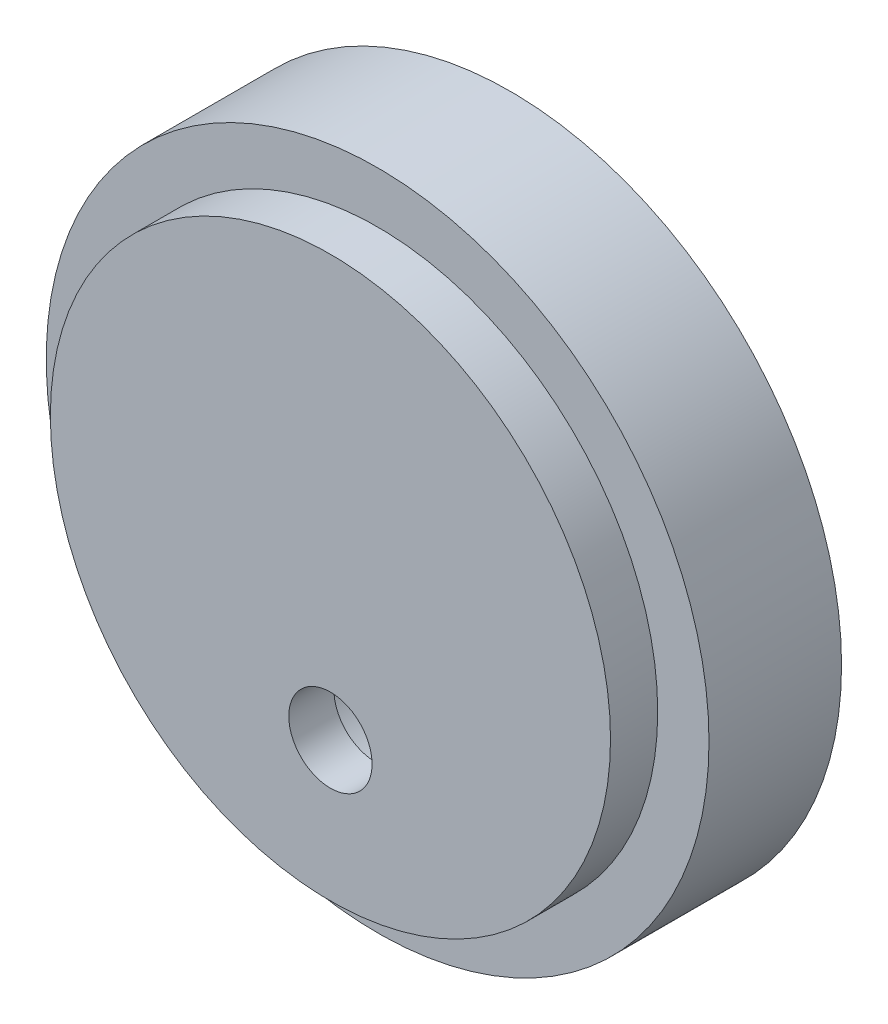
ISO-10303-21;
HEADER;
FILE_DESCRIPTION(('STEP AP214'),'2;1');
FILE_NAME('part.step','',(''),(''),'','','');
FILE_SCHEMA(('AUTOMOTIVE_DESIGN { 1 0 10303 214 1 1 1 1 }'));
ENDSEC;
DATA;
#1=APPLICATION_CONTEXT('core data for automotive mechanical design processes');
#2=APPLICATION_PROTOCOL_DEFINITION('international standard','automotive_design',2000,#1);
#3=PRODUCT_CONTEXT('',#1,'mechanical');
#4=PRODUCT('Part','Part','',(#3));
#5=PRODUCT_RELATED_PRODUCT_CATEGORY('part','',(#4));
#6=PRODUCT_DEFINITION_FORMATION('','',#4);
#7=PRODUCT_DEFINITION_CONTEXT('part definition',#1,'design');
#8=PRODUCT_DEFINITION('design','',#6,#7);
#9=PRODUCT_DEFINITION_SHAPE('','',#8);
#10=(LENGTH_UNIT() NAMED_UNIT(*) SI_UNIT(.MILLI.,.METRE.));
#11=(NAMED_UNIT(*) PLANE_ANGLE_UNIT() SI_UNIT($,.RADIAN.));
#12=(NAMED_UNIT(*) SI_UNIT($,.STERADIAN.) SOLID_ANGLE_UNIT());
#13=UNCERTAINTY_MEASURE_WITH_UNIT(LENGTH_MEASURE(1.E-05),#10,'distance_accuracy_value','');
#14=(GEOMETRIC_REPRESENTATION_CONTEXT(3) GLOBAL_UNCERTAINTY_ASSIGNED_CONTEXT((#13)) GLOBAL_UNIT_ASSIGNED_CONTEXT((#10,
#11,#12)) REPRESENTATION_CONTEXT('',''));
#15=CARTESIAN_POINT('',(0.,0.,0.));
#16=DIRECTION('',(0.,0.,1.));
#17=DIRECTION('',(1.,0.,0.));
#18=AXIS2_PLACEMENT_3D('',#15,#16,#17);
#19=CARTESIAN_POINT('',(1.57595454545456,0.,11.1252));
#20=DIRECTION('',(0.,0.,1.));
#21=DIRECTION('',(1.,0.,0.));
#22=AXIS2_PLACEMENT_3D('',#19,#20,#21);
#23=PLANE('',#22);
#24=CARTESIAN_POINT('',(0.,-8.7122,11.1252));
#25=DIRECTION('',(0.,0.,1.));
#26=DIRECTION('',(0.,-1.,0.));
#27=AXIS2_PLACEMENT_3D('',#24,#25,#26);
#28=CIRCLE('',#27,2.5781);
#29=CARTESIAN_POINT('',(0.,-11.2903,11.1252));
#30=VERTEX_POINT('',#29);
#31=EDGE_CURVE('E41',#30,#30,#28,.F.);
#32=ORIENTED_EDGE('',*,*,#31,.T.);
#33=EDGE_LOOP('',(#32));
#34=FACE_BOUND('',#33,.T.);
#35=CARTESIAN_POINT('',(0.,0.,11.1252));
#36=DIRECTION('',(0.,0.,1.));
#37=DIRECTION('',(1.,0.,0.));
#38=AXIS2_PLACEMENT_3D('',#35,#36,#37);
#39=CIRCLE('',#38,17.3355);
#40=CARTESIAN_POINT('',(17.3355,0.,11.1252));
#41=VERTEX_POINT('',#40);
#42=EDGE_CURVE('E19',#41,#41,#39,.F.);
#43=ORIENTED_EDGE('',*,*,#42,.F.);
#44=EDGE_LOOP('',(#43));
#45=FACE_BOUND('',#44,.T.);
#46=ADVANCED_FACE('F15',(#34,#45),#23,.T.);
#47=CARTESIAN_POINT('',(0.,0.,8.2042));
#48=DIRECTION('',(0.,0.,1.));
#49=DIRECTION('',(1.,0.,0.));
#50=AXIS2_PLACEMENT_3D('',#47,#48,#49);
#51=CYLINDRICAL_SURFACE('',#50,17.3355);
#52=ORIENTED_EDGE('',*,*,#42,.T.);
#53=EDGE_LOOP('',(#52));
#54=FACE_BOUND('',#53,.T.);
#55=CARTESIAN_POINT('',(0.,0.,8.2042));
#56=DIRECTION('',(0.,0.,1.));
#57=DIRECTION('',(1.,0.,0.));
#58=AXIS2_PLACEMENT_3D('',#55,#56,#57);
#59=CIRCLE('',#58,17.3355);
#60=CARTESIAN_POINT('',(17.3355,0.,8.2042));
#61=VERTEX_POINT('',#60);
#62=EDGE_CURVE('E39',#61,#61,#59,.F.);
#63=ORIENTED_EDGE('',*,*,#62,.F.);
#64=EDGE_LOOP('',(#63));
#65=FACE_BOUND('',#64,.T.);
#66=ADVANCED_FACE('F48',(#54,#65),#51,.T.);
#67=CARTESIAN_POINT('',(0.,-8.7122,8.3312));
#68=DIRECTION('',(0.,0.,1.));
#69=DIRECTION('',(0.,-1.,0.));
#70=AXIS2_PLACEMENT_3D('',#67,#68,#69);
#71=CYLINDRICAL_SURFACE('',#70,2.5781);
#72=ORIENTED_EDGE('',*,*,#31,.F.);
#73=EDGE_LOOP('',(#72));
#74=FACE_BOUND('',#73,.T.);
#75=CARTESIAN_POINT('',(0.,-8.7122,8.3312));
#76=DIRECTION('',(0.,0.,1.));
#77=DIRECTION('',(0.,-1.,0.));
#78=AXIS2_PLACEMENT_3D('',#75,#76,#77);
#79=CIRCLE('',#78,2.5781);
#80=CARTESIAN_POINT('',(0.,-11.2903,8.3312));
#81=VERTEX_POINT('',#80);
#82=EDGE_CURVE('E36',#81,#81,#79,.F.);
#83=ORIENTED_EDGE('',*,*,#82,.T.);
#84=EDGE_LOOP('',(#83));
#85=FACE_BOUND('',#84,.T.);
#86=ADVANCED_FACE('F57',(#74,#85),#71,.F.);
#87=CARTESIAN_POINT('',(1.86459090909091,0.,8.2042));
#88=DIRECTION('',(0.,0.,1.));
#89=DIRECTION('',(1.,0.,0.));
#90=AXIS2_PLACEMENT_3D('',#87,#88,#89);
#91=PLANE('',#90);
#92=ORIENTED_EDGE('',*,*,#62,.T.);
#93=EDGE_LOOP('',(#92));
#94=FACE_BOUND('',#93,.T.);
#95=CARTESIAN_POINT('',(0.,0.,8.2042));
#96=DIRECTION('',(0.,0.,1.));
#97=DIRECTION('',(1.,0.,0.));
#98=AXIS2_PLACEMENT_3D('',#95,#96,#97);
#99=CIRCLE('',#98,20.5105);
#100=CARTESIAN_POINT('',(20.5105,0.,8.2042));
#101=VERTEX_POINT('',#100);
#102=EDGE_CURVE('E33',#101,#101,#99,.F.);
#103=ORIENTED_EDGE('',*,*,#102,.F.);
#104=EDGE_LOOP('',(#103));
#105=FACE_BOUND('',#104,.T.);
#106=ADVANCED_FACE('F75',(#94,#105),#91,.T.);
#107=CARTESIAN_POINT('',(5.5499,-3.051302,8.3312));
#108=DIRECTION('',(0.,0.,1.));
#109=DIRECTION('',(-1.,0.,0.));
#110=AXIS2_PLACEMENT_3D('',#107,#108,#109);
#111=PLANE('',#110);
#112=ORIENTED_EDGE('',*,*,#82,.F.);
#113=EDGE_LOOP('',(#112));
#114=FACE_BOUND('',#113,.T.);
#115=CARTESIAN_POINT('',(0.,-8.7122,8.3312));
#116=DIRECTION('',(0.,0.,1.));
#117=DIRECTION('',(1.,0.,0.));
#118=AXIS2_PLACEMENT_3D('',#115,#116,#117);
#119=CIRCLE('',#118,5.5499);
#120=CARTESIAN_POINT('',(5.5499,-8.7122,8.3312));
#121=VERTEX_POINT('',#120);
#122=EDGE_CURVE('E28',#121,#121,#119,.F.);
#123=ORIENTED_EDGE('',*,*,#122,.T.);
#124=EDGE_LOOP('',(#123));
#125=FACE_BOUND('',#124,.T.);
#126=ADVANCED_FACE('F73',(#114,#125),#111,.F.);
#127=CARTESIAN_POINT('',(0.,0.,0.));
#128=DIRECTION('',(0.,0.,1.));
#129=DIRECTION('',(1.,0.,0.));
#130=AXIS2_PLACEMENT_3D('',#127,#128,#129);
#131=CYLINDRICAL_SURFACE('',#130,20.5105);
#132=CARTESIAN_POINT('',(0.,0.,0.));
#133=DIRECTION('',(0.,0.,1.));
#134=DIRECTION('',(1.,0.,0.));
#135=AXIS2_PLACEMENT_3D('',#132,#133,#134);
#136=CIRCLE('',#135,20.5105);
#137=CARTESIAN_POINT('',(20.5105,0.,0.));
#138=VERTEX_POINT('',#137);
#139=EDGE_CURVE('E23',#138,#138,#136,.T.);
#140=ORIENTED_EDGE('',*,*,#139,.T.);
#141=EDGE_LOOP('',(#140));
#142=FACE_BOUND('',#141,.T.);
#143=ORIENTED_EDGE('',*,*,#102,.T.);
#144=EDGE_LOOP('',(#143));
#145=FACE_BOUND('',#144,.T.);
#146=ADVANCED_FACE('F67',(#142,#145),#131,.T.);
#147=CARTESIAN_POINT('',(0.,-8.7122,0.));
#148=DIRECTION('',(0.,0.,1.));
#149=DIRECTION('',(1.,0.,0.));
#150=AXIS2_PLACEMENT_3D('',#147,#148,#149);
#151=CYLINDRICAL_SURFACE('',#150,5.5499);
#152=ORIENTED_EDGE('',*,*,#122,.F.);
#153=EDGE_LOOP('',(#152));
#154=FACE_BOUND('',#153,.T.);
#155=CARTESIAN_POINT('',(0.,-8.7122,0.));
#156=DIRECTION('',(0.,0.,1.));
#157=DIRECTION('',(1.,0.,0.));
#158=AXIS2_PLACEMENT_3D('',#155,#156,#157);
#159=CIRCLE('',#158,5.5499);
#160=CARTESIAN_POINT('',(5.5499,-8.7122,0.));
#161=VERTEX_POINT('',#160);
#162=EDGE_CURVE('E10',#161,#161,#159,.F.);
#163=ORIENTED_EDGE('',*,*,#162,.T.);
#164=EDGE_LOOP('',(#163));
#165=FACE_BOUND('',#164,.T.);
#166=ADVANCED_FACE('F17',(#154,#165),#151,.F.);
#167=CARTESIAN_POINT('',(1.86459090909091,0.,0.));
#168=DIRECTION('',(0.,0.,1.));
#169=DIRECTION('',(1.,0.,0.));
#170=AXIS2_PLACEMENT_3D('',#167,#168,#169);
#171=PLANE('',#170);
#172=ORIENTED_EDGE('',*,*,#162,.F.);
#173=EDGE_LOOP('',(#172));
#174=FACE_BOUND('',#173,.T.);
#175=ORIENTED_EDGE('',*,*,#139,.F.);
#176=EDGE_LOOP('',(#175));
#177=FACE_BOUND('',#176,.T.);
#178=ADVANCED_FACE('F60',(#174,#177),#171,.F.);
#179=CLOSED_SHELL('',(#46,#66,#86,#106,#126,#146,#166,#178));
#180=MANIFOLD_SOLID_BREP('B1',#179);
#181=ADVANCED_BREP_SHAPE_REPRESENTATION('',(#18,#180),#14);
#182=SHAPE_DEFINITION_REPRESENTATION(#9,#181);
ENDSEC;
END-ISO-10303-21;
